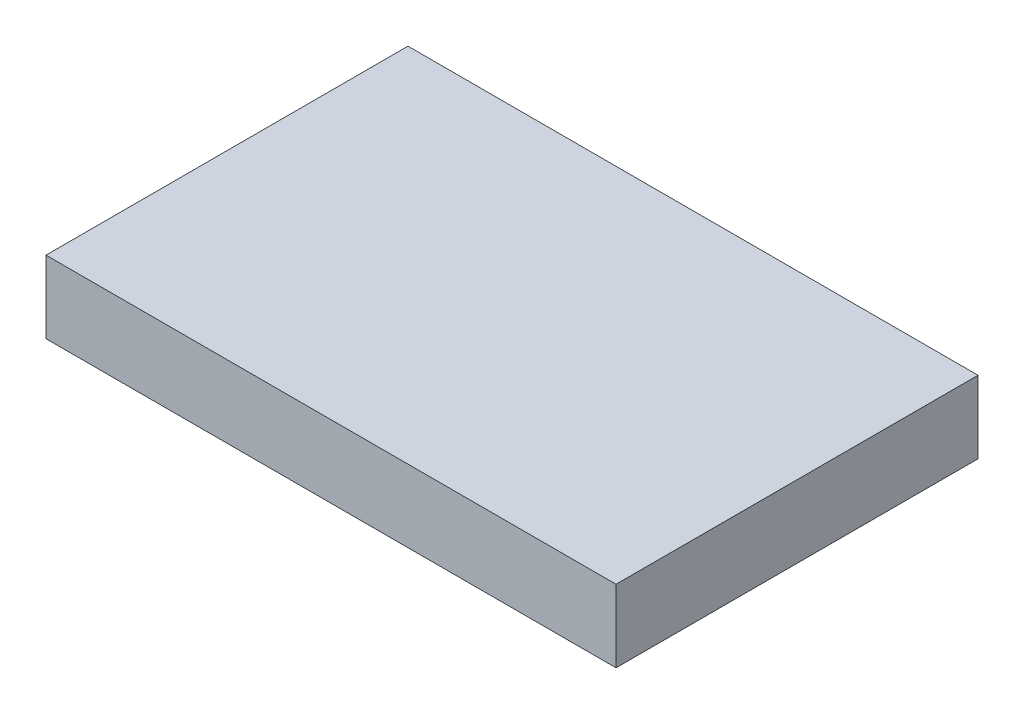
ISO-10303-21;
HEADER;
FILE_DESCRIPTION(('STEP AP214'),'2;1');
FILE_NAME('part.step','',(''),(''),'','','');
FILE_SCHEMA(('AUTOMOTIVE_DESIGN { 1 0 10303 214 1 1 1 1 }'));
ENDSEC;
DATA;
#1=APPLICATION_CONTEXT('core data for automotive mechanical design processes');
#2=APPLICATION_PROTOCOL_DEFINITION('international standard','automotive_design',2000,#1);
#3=PRODUCT_CONTEXT('',#1,'mechanical');
#4=PRODUCT('Part','Part','',(#3));
#5=PRODUCT_RELATED_PRODUCT_CATEGORY('part','',(#4));
#6=PRODUCT_DEFINITION_FORMATION('','',#4);
#7=PRODUCT_DEFINITION_CONTEXT('part definition',#1,'design');
#8=PRODUCT_DEFINITION('design','',#6,#7);
#9=PRODUCT_DEFINITION_SHAPE('','',#8);
#10=(LENGTH_UNIT() NAMED_UNIT(*) SI_UNIT(.MILLI.,.METRE.));
#11=(NAMED_UNIT(*) PLANE_ANGLE_UNIT() SI_UNIT($,.RADIAN.));
#12=(NAMED_UNIT(*) SI_UNIT($,.STERADIAN.) SOLID_ANGLE_UNIT());
#13=UNCERTAINTY_MEASURE_WITH_UNIT(LENGTH_MEASURE(1.E-05),#10,'distance_accuracy_value','');
#14=(GEOMETRIC_REPRESENTATION_CONTEXT(3) GLOBAL_UNCERTAINTY_ASSIGNED_CONTEXT((#13)) GLOBAL_UNIT_ASSIGNED_CONTEXT((#10,
#11,#12)) REPRESENTATION_CONTEXT('',''));
#15=CARTESIAN_POINT('',(0.,0.,0.));
#16=DIRECTION('',(0.,0.,1.));
#17=DIRECTION('',(1.,0.,0.));
#18=AXIS2_PLACEMENT_3D('',#15,#16,#17);
#19=CARTESIAN_POINT('',(0.,25.4,0.));
#20=DIRECTION('',(1.,0.,0.));
#21=DIRECTION('',(0.,0.,-1.));
#22=AXIS2_PLACEMENT_3D('',#19,#20,#21);
#23=PLANE('',#22);
#24=DIRECTION('',(0.,0.,1.));
#25=VECTOR('',#24,1.);
#26=CARTESIAN_POINT('',(0.,0.,0.));
#27=LINE('',#26,#25);
#28=CARTESIAN_POINT('',(0.,0.,-127.));
#29=VERTEX_POINT('',#28);
#30=CARTESIAN_POINT('',(0.,0.,0.));
#31=VERTEX_POINT('',#30);
#32=EDGE_CURVE('E96',#29,#31,#27,.T.);
#33=ORIENTED_EDGE('',*,*,#32,.T.);
#34=DIRECTION('',(0.,-1.,0.));
#35=VECTOR('',#34,1.);
#36=CARTESIAN_POINT('',(0.,25.4,0.));
#37=LINE('',#36,#35);
#38=CARTESIAN_POINT('',(0.,25.4,0.));
#39=VERTEX_POINT('',#38);
#40=EDGE_CURVE('E11',#39,#31,#37,.T.);
#41=ORIENTED_EDGE('',*,*,#40,.F.);
#42=DIRECTION('',(0.,0.,1.));
#43=VECTOR('',#42,1.);
#44=CARTESIAN_POINT('',(0.,25.4,0.));
#45=LINE('',#44,#43);
#46=CARTESIAN_POINT('',(0.,25.4,-127.));
#47=VERTEX_POINT('',#46);
#48=EDGE_CURVE('E84',#47,#39,#45,.T.);
#49=ORIENTED_EDGE('',*,*,#48,.F.);
#50=DIRECTION('',(0.,-1.,0.));
#51=VECTOR('',#50,1.);
#52=CARTESIAN_POINT('',(0.,25.4,-127.));
#53=LINE('',#52,#51);
#54=EDGE_CURVE('E92',#47,#29,#53,.T.);
#55=ORIENTED_EDGE('',*,*,#54,.T.);
#56=EDGE_LOOP('',(#33,#41,#49,#55));
#57=FACE_BOUND('',#56,.T.);
#58=ADVANCED_FACE('F33',(#57),#23,.F.);
#59=CARTESIAN_POINT('',(0.,25.4,0.));
#60=DIRECTION('',(0.,0.,-1.));
#61=DIRECTION('',(-1.,0.,0.));
#62=AXIS2_PLACEMENT_3D('',#59,#60,#61);
#63=PLANE('',#62);
#64=DIRECTION('',(1.,0.,0.));
#65=VECTOR('',#64,1.);
#66=CARTESIAN_POINT('',(0.,0.,0.));
#67=LINE('',#66,#65);
#68=CARTESIAN_POINT('',(200.,0.,0.));
#69=VERTEX_POINT('',#68);
#70=EDGE_CURVE('E88',#31,#69,#67,.T.);
#71=ORIENTED_EDGE('',*,*,#70,.T.);
#72=DIRECTION('',(0.,-1.,0.));
#73=VECTOR('',#72,1.);
#74=CARTESIAN_POINT('',(200.,25.4,0.));
#75=LINE('',#74,#73);
#76=CARTESIAN_POINT('',(200.,25.4,0.));
#77=VERTEX_POINT('',#76);
#78=EDGE_CURVE('E41',#77,#69,#75,.T.);
#79=ORIENTED_EDGE('',*,*,#78,.F.);
#80=DIRECTION('',(1.,0.,0.));
#81=VECTOR('',#80,1.);
#82=CARTESIAN_POINT('',(0.,25.4,0.));
#83=LINE('',#82,#81);
#84=EDGE_CURVE('E79',#39,#77,#83,.T.);
#85=ORIENTED_EDGE('',*,*,#84,.F.);
#86=ORIENTED_EDGE('',*,*,#40,.T.);
#87=EDGE_LOOP('',(#71,#79,#85,#86));
#88=FACE_BOUND('',#87,.T.);
#89=ADVANCED_FACE('F87',(#88),#63,.F.);
#90=CARTESIAN_POINT('',(200.,25.4,0.));
#91=DIRECTION('',(-1.,0.,0.));
#92=DIRECTION('',(0.,0.,1.));
#93=AXIS2_PLACEMENT_3D('',#90,#91,#92);
#94=PLANE('',#93);
#95=DIRECTION('',(0.,0.,-1.));
#96=VECTOR('',#95,1.);
#97=CARTESIAN_POINT('',(200.,0.,0.));
#98=LINE('',#97,#96);
#99=CARTESIAN_POINT('',(200.,0.,-127.));
#100=VERTEX_POINT('',#99);
#101=EDGE_CURVE('E66',#69,#100,#98,.T.);
#102=ORIENTED_EDGE('',*,*,#101,.T.);
#103=DIRECTION('',(0.,-1.,0.));
#104=VECTOR('',#103,1.);
#105=CARTESIAN_POINT('',(200.,25.4,-127.));
#106=LINE('',#105,#104);
#107=CARTESIAN_POINT('',(200.,25.4,-127.));
#108=VERTEX_POINT('',#107);
#109=EDGE_CURVE('E89',#108,#100,#106,.T.);
#110=ORIENTED_EDGE('',*,*,#109,.F.);
#111=DIRECTION('',(0.,0.,-1.));
#112=VECTOR('',#111,1.);
#113=CARTESIAN_POINT('',(200.,25.4,0.));
#114=LINE('',#113,#112);
#115=EDGE_CURVE('E82',#77,#108,#114,.T.);
#116=ORIENTED_EDGE('',*,*,#115,.F.);
#117=ORIENTED_EDGE('',*,*,#78,.T.);
#118=EDGE_LOOP('',(#102,#110,#116,#117));
#119=FACE_BOUND('',#118,.T.);
#120=ADVANCED_FACE('F90',(#119),#94,.F.);
#121=CARTESIAN_POINT('',(0.,25.4,-127.));
#122=DIRECTION('',(0.,0.,1.));
#123=DIRECTION('',(1.,0.,0.));
#124=AXIS2_PLACEMENT_3D('',#121,#122,#123);
#125=PLANE('',#124);
#126=DIRECTION('',(-1.,0.,0.));
#127=VECTOR('',#126,1.);
#128=CARTESIAN_POINT('',(0.,0.,-127.));
#129=LINE('',#128,#127);
#130=EDGE_CURVE('E72',#100,#29,#129,.T.);
#131=ORIENTED_EDGE('',*,*,#130,.T.);
#132=ORIENTED_EDGE('',*,*,#54,.F.);
#133=DIRECTION('',(-1.,0.,0.));
#134=VECTOR('',#133,1.);
#135=CARTESIAN_POINT('',(0.,25.4,-127.));
#136=LINE('',#135,#134);
#137=EDGE_CURVE('E49',#108,#47,#136,.T.);
#138=ORIENTED_EDGE('',*,*,#137,.F.);
#139=ORIENTED_EDGE('',*,*,#109,.T.);
#140=EDGE_LOOP('',(#131,#132,#138,#139));
#141=FACE_BOUND('',#140,.T.);
#142=ADVANCED_FACE('F103',(#141),#125,.F.);
#143=CARTESIAN_POINT('',(0.,25.4,-127.));
#144=DIRECTION('',(0.,-1.,0.));
#145=DIRECTION('',(0.,0.,-1.));
#146=AXIS2_PLACEMENT_3D('',#143,#144,#145);
#147=PLANE('',#146);
#148=ORIENTED_EDGE('',*,*,#48,.T.);
#149=ORIENTED_EDGE('',*,*,#84,.T.);
#150=ORIENTED_EDGE('',*,*,#115,.T.);
#151=ORIENTED_EDGE('',*,*,#137,.T.);
#152=EDGE_LOOP('',(#148,#149,#150,#151));
#153=FACE_BOUND('',#152,.T.);
#154=ADVANCED_FACE('F80',(#153),#147,.F.);
#155=CARTESIAN_POINT('',(0.,0.,-127.));
#156=DIRECTION('',(0.,-1.,0.));
#157=DIRECTION('',(0.,0.,-1.));
#158=AXIS2_PLACEMENT_3D('',#155,#156,#157);
#159=PLANE('',#158);
#160=ORIENTED_EDGE('',*,*,#32,.F.);
#161=ORIENTED_EDGE('',*,*,#130,.F.);
#162=ORIENTED_EDGE('',*,*,#101,.F.);
#163=ORIENTED_EDGE('',*,*,#70,.F.);
#164=EDGE_LOOP('',(#160,#161,#162,#163));
#165=FACE_BOUND('',#164,.T.);
#166=ADVANCED_FACE('F106',(#165),#159,.T.);
#167=CLOSED_SHELL('',(#58,#89,#120,#142,#154,#166));
#168=MANIFOLD_SOLID_BREP('B2',#167);
#169=ADVANCED_BREP_SHAPE_REPRESENTATION('',(#18,#168),#14);
#170=SHAPE_DEFINITION_REPRESENTATION(#9,#169);
ENDSEC;
END-ISO-10303-21;
